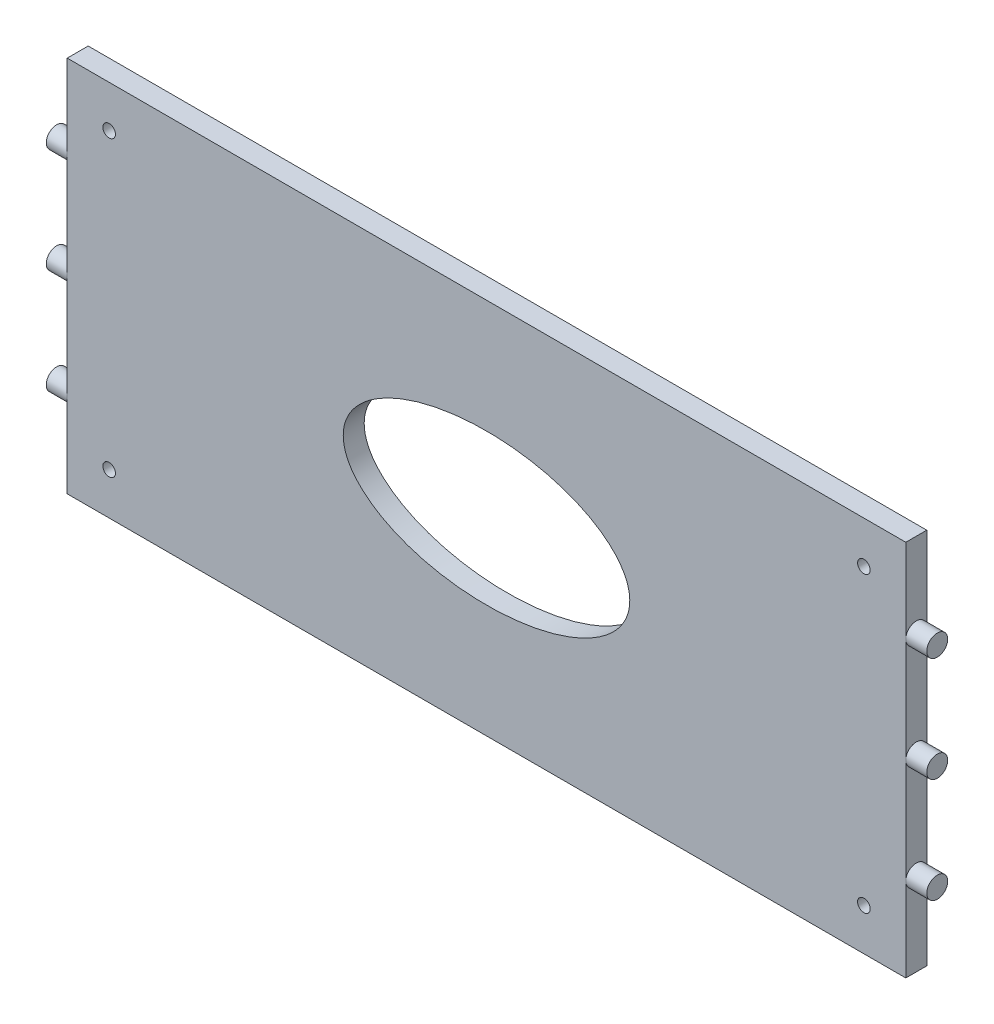
ISO-10303-21;
HEADER;
FILE_DESCRIPTION(('STEP AP214'),'2;1');
FILE_NAME('part.step','',(''),(''),'','','');
FILE_SCHEMA(('AUTOMOTIVE_DESIGN { 1 0 10303 214 1 1 1 1 }'));
ENDSEC;
DATA;
#1=APPLICATION_CONTEXT('core data for automotive mechanical design processes');
#2=APPLICATION_PROTOCOL_DEFINITION('international standard','automotive_design',2000,#1);
#3=PRODUCT_CONTEXT('',#1,'mechanical');
#4=PRODUCT('Part','Part','',(#3));
#5=PRODUCT_RELATED_PRODUCT_CATEGORY('part','',(#4));
#6=PRODUCT_DEFINITION_FORMATION('','',#4);
#7=PRODUCT_DEFINITION_CONTEXT('part definition',#1,'design');
#8=PRODUCT_DEFINITION('design','',#6,#7);
#9=PRODUCT_DEFINITION_SHAPE('','',#8);
#10=(LENGTH_UNIT() NAMED_UNIT(*) SI_UNIT(.MILLI.,.METRE.));
#11=(NAMED_UNIT(*) PLANE_ANGLE_UNIT() SI_UNIT($,.RADIAN.));
#12=(NAMED_UNIT(*) SI_UNIT($,.STERADIAN.) SOLID_ANGLE_UNIT());
#13=UNCERTAINTY_MEASURE_WITH_UNIT(LENGTH_MEASURE(1.E-05),#10,'distance_accuracy_value','');
#14=(GEOMETRIC_REPRESENTATION_CONTEXT(3) GLOBAL_UNCERTAINTY_ASSIGNED_CONTEXT((#13)) GLOBAL_UNIT_ASSIGNED_CONTEXT((#10,
#11,#12)) REPRESENTATION_CONTEXT('',''));
#15=CARTESIAN_POINT('',(0.,0.,0.));
#16=DIRECTION('',(0.,0.,1.));
#17=DIRECTION('',(1.,0.,0.));
#18=AXIS2_PLACEMENT_3D('',#15,#16,#17);
#19=CARTESIAN_POINT('',(-100.,-45.,5.));
#20=DIRECTION('',(1.,0.,0.));
#21=DIRECTION('',(0.,0.,-1.));
#22=AXIS2_PLACEMENT_3D('',#19,#20,#21);
#23=PLANE('',#22);
#24=DIRECTION('',(0.,-1.,0.));
#25=VECTOR('',#24,1.);
#26=CARTESIAN_POINT('',(-100.,-45.,0.));
#27=LINE('',#26,#25);
#28=CARTESIAN_POINT('',(-100.,0.,0.));
#29=VERTEX_POINT('',#28);
#30=CARTESIAN_POINT('',(-100.,-25.,0.));
#31=VERTEX_POINT('',#30);
#32=EDGE_CURVE('E130',#29,#31,#27,.T.);
#33=ORIENTED_EDGE('',*,*,#32,.T.);
#34=CARTESIAN_POINT('',(-100.,-25.,2.5));
#35=DIRECTION('',(1.,0.,0.));
#36=DIRECTION('',(0.,0.,-1.));
#37=AXIS2_PLACEMENT_3D('',#34,#35,#36);
#38=CIRCLE('',#37,2.5);
#39=CARTESIAN_POINT('',(-100.,-25.,5.));
#40=VERTEX_POINT('',#39);
#41=EDGE_CURVE('E56',#31,#40,#38,.T.);
#42=ORIENTED_EDGE('',*,*,#41,.T.);
#43=DIRECTION('',(0.,-1.,0.));
#44=VECTOR('',#43,1.);
#45=CARTESIAN_POINT('',(-100.,-45.,5.));
#46=LINE('',#45,#44);
#47=CARTESIAN_POINT('',(-100.,0.,5.));
#48=VERTEX_POINT('',#47);
#49=EDGE_CURVE('E127',#48,#40,#46,.T.);
#50=ORIENTED_EDGE('',*,*,#49,.F.);
#51=CARTESIAN_POINT('',(-100.,0.,2.5));
#52=DIRECTION('',(1.,0.,0.));
#53=DIRECTION('',(0.,0.,-1.));
#54=AXIS2_PLACEMENT_3D('',#51,#52,#53);
#55=CIRCLE('',#54,2.5);
#56=EDGE_CURVE('E216',#48,#29,#55,.T.);
#57=ORIENTED_EDGE('',*,*,#56,.T.);
#58=EDGE_LOOP('',(#33,#42,#50,#57));
#59=FACE_BOUND('',#58,.T.);
#60=ADVANCED_FACE('F39',(#59),#23,.F.);
#61=CARTESIAN_POINT('',(-100.,25.,0.));
#62=VERTEX_POINT('',#61);
#63=EDGE_CURVE('E164',#62,#29,#27,.T.);
#64=ORIENTED_EDGE('',*,*,#63,.T.);
#65=EDGE_CURVE('E63',#29,#48,#55,.T.);
#66=ORIENTED_EDGE('',*,*,#65,.T.);
#67=CARTESIAN_POINT('',(-100.,25.,5.));
#68=VERTEX_POINT('',#67);
#69=EDGE_CURVE('E145',#68,#48,#46,.T.);
#70=ORIENTED_EDGE('',*,*,#69,.F.);
#71=CARTESIAN_POINT('',(-100.,25.,2.5));
#72=DIRECTION('',(1.,0.,0.));
#73=DIRECTION('',(0.,0.,-1.));
#74=AXIS2_PLACEMENT_3D('',#71,#72,#73);
#75=CIRCLE('',#74,2.5);
#76=EDGE_CURVE('E11',#68,#62,#75,.T.);
#77=ORIENTED_EDGE('',*,*,#76,.T.);
#78=EDGE_LOOP('',(#64,#66,#70,#77));
#79=FACE_BOUND('',#78,.T.);
#80=ADVANCED_FACE('F307',(#79),#23,.F.);
#81=CARTESIAN_POINT('',(-100.,45.,0.));
#82=VERTEX_POINT('',#81);
#83=EDGE_CURVE('E160',#82,#62,#27,.T.);
#84=ORIENTED_EDGE('',*,*,#83,.T.);
#85=EDGE_CURVE('E50',#62,#68,#75,.T.);
#86=ORIENTED_EDGE('',*,*,#85,.T.);
#87=CARTESIAN_POINT('',(-100.,45.,5.));
#88=VERTEX_POINT('',#87);
#89=EDGE_CURVE('E141',#88,#68,#46,.T.);
#90=ORIENTED_EDGE('',*,*,#89,.F.);
#91=DIRECTION('',(0.,0.,-1.));
#92=VECTOR('',#91,1.);
#93=CARTESIAN_POINT('',(-100.,45.,5.));
#94=LINE('',#93,#92);
#95=EDGE_CURVE('E169',#88,#82,#94,.T.);
#96=ORIENTED_EDGE('',*,*,#95,.T.);
#97=EDGE_LOOP('',(#84,#86,#90,#96));
#98=FACE_BOUND('',#97,.T.);
#99=ADVANCED_FACE('F298',(#98),#23,.F.);
#100=CARTESIAN_POINT('',(100.,-45.,5.));
#101=DIRECTION('',(-1.,0.,0.));
#102=DIRECTION('',(0.,0.,1.));
#103=AXIS2_PLACEMENT_3D('',#100,#101,#102);
#104=PLANE('',#103);
#105=CARTESIAN_POINT('',(100.,-25.,2.5));
#106=DIRECTION('',(1.,0.,0.));
#107=DIRECTION('',(0.,0.,-1.));
#108=AXIS2_PLACEMENT_3D('',#105,#106,#107);
#109=CIRCLE('',#108,2.5);
#110=CARTESIAN_POINT('',(100.,-25.,5.));
#111=VERTEX_POINT('',#110);
#112=CARTESIAN_POINT('',(100.,-25.,0.));
#113=VERTEX_POINT('',#112);
#114=EDGE_CURVE('E206',#111,#113,#109,.T.);
#115=ORIENTED_EDGE('',*,*,#114,.F.);
#116=DIRECTION('',(0.,1.,0.));
#117=VECTOR('',#116,1.);
#118=CARTESIAN_POINT('',(100.,-45.,5.));
#119=LINE('',#118,#117);
#120=CARTESIAN_POINT('',(100.,-45.,5.));
#121=VERTEX_POINT('',#120);
#122=EDGE_CURVE('E326',#121,#111,#119,.T.);
#123=ORIENTED_EDGE('',*,*,#122,.F.);
#124=DIRECTION('',(0.,0.,-1.));
#125=VECTOR('',#124,1.);
#126=CARTESIAN_POINT('',(100.,-45.,5.));
#127=LINE('',#126,#125);
#128=CARTESIAN_POINT('',(100.,-45.,0.));
#129=VERTEX_POINT('',#128);
#130=EDGE_CURVE('E151',#121,#129,#127,.T.);
#131=ORIENTED_EDGE('',*,*,#130,.T.);
#132=DIRECTION('',(0.,1.,0.));
#133=VECTOR('',#132,1.);
#134=CARTESIAN_POINT('',(100.,-45.,0.));
#135=LINE('',#134,#133);
#136=EDGE_CURVE('E152',#129,#113,#135,.T.);
#137=ORIENTED_EDGE('',*,*,#136,.T.);
#138=EDGE_LOOP('',(#115,#123,#131,#137));
#139=FACE_BOUND('',#138,.T.);
#140=ADVANCED_FACE('F305',(#139),#104,.F.);
#141=EDGE_CURVE('E202',#113,#111,#109,.T.);
#142=ORIENTED_EDGE('',*,*,#141,.F.);
#143=CARTESIAN_POINT('',(100.,0.,0.));
#144=VERTEX_POINT('',#143);
#145=EDGE_CURVE('E156',#113,#144,#135,.T.);
#146=ORIENTED_EDGE('',*,*,#145,.T.);
#147=CARTESIAN_POINT('',(100.,0.,2.5));
#148=DIRECTION('',(1.,0.,0.));
#149=DIRECTION('',(0.,0.,-1.));
#150=AXIS2_PLACEMENT_3D('',#147,#148,#149);
#151=CIRCLE('',#150,2.5);
#152=CARTESIAN_POINT('',(100.,0.,5.));
#153=VERTEX_POINT('',#152);
#154=EDGE_CURVE('E191',#153,#144,#151,.T.);
#155=ORIENTED_EDGE('',*,*,#154,.F.);
#156=EDGE_CURVE('E328',#111,#153,#119,.T.);
#157=ORIENTED_EDGE('',*,*,#156,.F.);
#158=EDGE_LOOP('',(#142,#146,#155,#157));
#159=FACE_BOUND('',#158,.T.);
#160=ADVANCED_FACE('F339',(#159),#104,.F.);
#161=CARTESIAN_POINT('',(100.,25.,2.5));
#162=DIRECTION('',(1.,0.,0.));
#163=DIRECTION('',(0.,0.,-1.));
#164=AXIS2_PLACEMENT_3D('',#161,#162,#163);
#165=CIRCLE('',#164,2.5);
#166=CARTESIAN_POINT('',(100.,25.,0.));
#167=VERTEX_POINT('',#166);
#168=CARTESIAN_POINT('',(100.,25.,5.));
#169=VERTEX_POINT('',#168);
#170=EDGE_CURVE('E181',#167,#169,#165,.T.);
#171=ORIENTED_EDGE('',*,*,#170,.F.);
#172=CARTESIAN_POINT('',(100.,45.,0.));
#173=VERTEX_POINT('',#172);
#174=EDGE_CURVE('E157',#167,#173,#135,.T.);
#175=ORIENTED_EDGE('',*,*,#174,.T.);
#176=DIRECTION('',(0.,0.,-1.));
#177=VECTOR('',#176,1.);
#178=CARTESIAN_POINT('',(100.,45.,5.));
#179=LINE('',#178,#177);
#180=CARTESIAN_POINT('',(100.,45.,5.));
#181=VERTEX_POINT('',#180);
#182=EDGE_CURVE('E43',#181,#173,#179,.T.);
#183=ORIENTED_EDGE('',*,*,#182,.F.);
#184=EDGE_CURVE('E166',#169,#181,#119,.T.);
#185=ORIENTED_EDGE('',*,*,#184,.F.);
#186=EDGE_LOOP('',(#171,#175,#183,#185));
#187=FACE_BOUND('',#186,.T.);
#188=ADVANCED_FACE('F303',(#187),#104,.F.);
#189=EDGE_CURVE('E187',#144,#153,#151,.T.);
#190=ORIENTED_EDGE('',*,*,#189,.F.);
#191=EDGE_CURVE('E333',#144,#167,#135,.T.);
#192=ORIENTED_EDGE('',*,*,#191,.T.);
#193=EDGE_CURVE('E48',#169,#167,#165,.T.);
#194=ORIENTED_EDGE('',*,*,#193,.F.);
#195=EDGE_CURVE('E329',#153,#169,#119,.T.);
#196=ORIENTED_EDGE('',*,*,#195,.F.);
#197=EDGE_LOOP('',(#190,#192,#194,#196));
#198=FACE_BOUND('',#197,.T.);
#199=ADVANCED_FACE('F41',(#198),#104,.F.);
#200=CARTESIAN_POINT('',(-100.,45.,5.));
#201=DIRECTION('',(0.,-1.,0.));
#202=DIRECTION('',(0.,0.,-1.));
#203=AXIS2_PLACEMENT_3D('',#200,#201,#202);
#204=PLANE('',#203);
#205=DIRECTION('',(-1.,0.,0.));
#206=VECTOR('',#205,1.);
#207=CARTESIAN_POINT('',(-100.,45.,0.));
#208=LINE('',#207,#206);
#209=EDGE_CURVE('E155',#173,#82,#208,.T.);
#210=ORIENTED_EDGE('',*,*,#209,.T.);
#211=ORIENTED_EDGE('',*,*,#95,.F.);
#212=DIRECTION('',(-1.,0.,0.));
#213=VECTOR('',#212,1.);
#214=CARTESIAN_POINT('',(-100.,45.,5.));
#215=LINE('',#214,#213);
#216=EDGE_CURVE('E139',#181,#88,#215,.T.);
#217=ORIENTED_EDGE('',*,*,#216,.F.);
#218=ORIENTED_EDGE('',*,*,#182,.T.);
#219=EDGE_LOOP('',(#210,#211,#217,#218));
#220=FACE_BOUND('',#219,.T.);
#221=ADVANCED_FACE('F297',(#220),#204,.F.);
#222=CARTESIAN_POINT('',(-100.,-45.,5.));
#223=VERTEX_POINT('',#222);
#224=EDGE_CURVE('E133',#40,#223,#46,.T.);
#225=ORIENTED_EDGE('',*,*,#224,.F.);
#226=EDGE_CURVE('E116',#40,#31,#38,.T.);
#227=ORIENTED_EDGE('',*,*,#226,.T.);
#228=CARTESIAN_POINT('',(-100.,-45.,0.));
#229=VERTEX_POINT('',#228);
#230=EDGE_CURVE('E159',#31,#229,#27,.T.);
#231=ORIENTED_EDGE('',*,*,#230,.T.);
#232=DIRECTION('',(0.,0.,-1.));
#233=VECTOR('',#232,1.);
#234=CARTESIAN_POINT('',(-100.,-45.,5.));
#235=LINE('',#234,#233);
#236=EDGE_CURVE('E136',#223,#229,#235,.T.);
#237=ORIENTED_EDGE('',*,*,#236,.F.);
#238=EDGE_LOOP('',(#225,#227,#231,#237));
#239=FACE_BOUND('',#238,.T.);
#240=ADVANCED_FACE('F134',(#239),#23,.F.);
#241=CARTESIAN_POINT('',(-100.,-45.,5.));
#242=DIRECTION('',(0.,1.,0.));
#243=DIRECTION('',(0.,0.,1.));
#244=AXIS2_PLACEMENT_3D('',#241,#242,#243);
#245=PLANE('',#244);
#246=DIRECTION('',(1.,0.,0.));
#247=VECTOR('',#246,1.);
#248=CARTESIAN_POINT('',(-100.,-45.,0.));
#249=LINE('',#248,#247);
#250=EDGE_CURVE('E163',#229,#129,#249,.T.);
#251=ORIENTED_EDGE('',*,*,#250,.T.);
#252=ORIENTED_EDGE('',*,*,#130,.F.);
#253=DIRECTION('',(1.,0.,0.));
#254=VECTOR('',#253,1.);
#255=CARTESIAN_POINT('',(-100.,-45.,5.));
#256=LINE('',#255,#254);
#257=EDGE_CURVE('E148',#223,#121,#256,.T.);
#258=ORIENTED_EDGE('',*,*,#257,.F.);
#259=ORIENTED_EDGE('',*,*,#236,.T.);
#260=EDGE_LOOP('',(#251,#252,#258,#259));
#261=FACE_BOUND('',#260,.T.);
#262=ADVANCED_FACE('F288',(#261),#245,.F.);
#263=CARTESIAN_POINT('',(0.,0.,5.));
#264=DIRECTION('',(0.,0.,-1.));
#265=DIRECTION('',(-1.,0.,0.));
#266=AXIS2_PLACEMENT_3D('',#263,#264,#265);
#267=PLANE('',#266);
#268=CARTESIAN_POINT('',(-90.,35.,5.));
#269=DIRECTION('',(0.,0.,-1.));
#270=DIRECTION('',(1.,0.,0.));
#271=AXIS2_PLACEMENT_3D('',#268,#269,#270);
#272=CIRCLE('',#271,1.5);
#273=CARTESIAN_POINT('',(-88.5,35.,5.));
#274=VERTEX_POINT('',#273);
#275=EDGE_CURVE('E228',#274,#274,#272,.T.);
#276=ORIENTED_EDGE('',*,*,#275,.T.);
#277=EDGE_LOOP('',(#276));
#278=FACE_BOUND('',#277,.T.);
#279=CARTESIAN_POINT('',(-90.,-35.,5.));
#280=DIRECTION('',(0.,0.,-1.));
#281=DIRECTION('',(-1.,0.,0.));
#282=AXIS2_PLACEMENT_3D('',#279,#280,#281);
#283=CIRCLE('',#282,1.5);
#284=CARTESIAN_POINT('',(-91.5,-35.,5.));
#285=VERTEX_POINT('',#284);
#286=EDGE_CURVE('E593',#285,#285,#283,.T.);
#287=ORIENTED_EDGE('',*,*,#286,.T.);
#288=EDGE_LOOP('',(#287));
#289=FACE_BOUND('',#288,.T.);
#290=CARTESIAN_POINT('',(90.,-35.,5.));
#291=DIRECTION('',(0.,0.,-1.));
#292=DIRECTION('',(1.,0.,0.));
#293=AXIS2_PLACEMENT_3D('',#290,#291,#292);
#294=CIRCLE('',#293,1.5);
#295=CARTESIAN_POINT('',(91.5,-35.,5.));
#296=VERTEX_POINT('',#295);
#297=EDGE_CURVE('E600',#296,#296,#294,.T.);
#298=ORIENTED_EDGE('',*,*,#297,.T.);
#299=EDGE_LOOP('',(#298));
#300=FACE_BOUND('',#299,.T.);
#301=CARTESIAN_POINT('',(90.,35.,5.));
#302=DIRECTION('',(0.,0.,-1.));
#303=DIRECTION('',(-1.,0.,0.));
#304=AXIS2_PLACEMENT_3D('',#301,#302,#303);
#305=CIRCLE('',#304,1.5);
#306=CARTESIAN_POINT('',(88.5,35.,5.));
#307=VERTEX_POINT('',#306);
#308=EDGE_CURVE('E606',#307,#307,#305,.T.);
#309=ORIENTED_EDGE('',*,*,#308,.T.);
#310=EDGE_LOOP('',(#309));
#311=FACE_BOUND('',#310,.T.);
#312=CARTESIAN_POINT('',(0.,0.,5.));
#313=DIRECTION('',(0.,0.,-1.));
#314=DIRECTION('',(-1.,0.,0.));
#315=AXIS2_PLACEMENT_3D('',#312,#313,#314);
#316=ELLIPSE('',#315,34.1713517909551,17.9908772674234);
#317=CARTESIAN_POINT('',(-34.1713517909551,0.,5.));
#318=VERTEX_POINT('',#317);
#319=EDGE_CURVE('E121',#318,#318,#316,.T.);
#320=ORIENTED_EDGE('',*,*,#319,.T.);
#321=EDGE_LOOP('',(#320));
#322=FACE_BOUND('',#321,.T.);
#323=ORIENTED_EDGE('',*,*,#122,.T.);
#324=ORIENTED_EDGE('',*,*,#156,.T.);
#325=ORIENTED_EDGE('',*,*,#195,.T.);
#326=ORIENTED_EDGE('',*,*,#184,.T.);
#327=ORIENTED_EDGE('',*,*,#216,.T.);
#328=ORIENTED_EDGE('',*,*,#89,.T.);
#329=ORIENTED_EDGE('',*,*,#69,.T.);
#330=ORIENTED_EDGE('',*,*,#49,.T.);
#331=ORIENTED_EDGE('',*,*,#224,.T.);
#332=ORIENTED_EDGE('',*,*,#257,.T.);
#333=EDGE_LOOP('',(#323,#324,#325,#326,#327,#328,#329,#330,#331,#332));
#334=FACE_BOUND('',#333,.T.);
#335=ADVANCED_FACE('F142',(#278,#289,#300,#311,#322,#334),#267,.F.);
#336=CARTESIAN_POINT('',(0.,0.,0.));
#337=DIRECTION('',(0.,0.,-1.));
#338=DIRECTION('',(-1.,0.,0.));
#339=AXIS2_PLACEMENT_3D('',#336,#337,#338);
#340=PLANE('',#339);
#341=CARTESIAN_POINT('',(-90.,35.,0.));
#342=DIRECTION('',(0.,0.,-1.));
#343=DIRECTION('',(1.,0.,0.));
#344=AXIS2_PLACEMENT_3D('',#341,#342,#343);
#345=CIRCLE('',#344,1.5);
#346=CARTESIAN_POINT('',(-88.5,35.,0.));
#347=VERTEX_POINT('',#346);
#348=EDGE_CURVE('E592',#347,#347,#345,.T.);
#349=ORIENTED_EDGE('',*,*,#348,.F.);
#350=EDGE_LOOP('',(#349));
#351=FACE_BOUND('',#350,.T.);
#352=CARTESIAN_POINT('',(-90.,-35.,0.));
#353=DIRECTION('',(0.,0.,-1.));
#354=DIRECTION('',(-1.,0.,0.));
#355=AXIS2_PLACEMENT_3D('',#352,#353,#354);
#356=CIRCLE('',#355,1.5);
#357=CARTESIAN_POINT('',(-91.5,-35.,0.));
#358=VERTEX_POINT('',#357);
#359=EDGE_CURVE('E595',#358,#358,#356,.T.);
#360=ORIENTED_EDGE('',*,*,#359,.F.);
#361=EDGE_LOOP('',(#360));
#362=FACE_BOUND('',#361,.T.);
#363=CARTESIAN_POINT('',(90.,-35.,0.));
#364=DIRECTION('',(0.,0.,-1.));
#365=DIRECTION('',(1.,0.,0.));
#366=AXIS2_PLACEMENT_3D('',#363,#364,#365);
#367=CIRCLE('',#366,1.5);
#368=CARTESIAN_POINT('',(91.5,-35.,0.));
#369=VERTEX_POINT('',#368);
#370=EDGE_CURVE('E603',#369,#369,#367,.T.);
#371=ORIENTED_EDGE('',*,*,#370,.F.);
#372=EDGE_LOOP('',(#371));
#373=FACE_BOUND('',#372,.T.);
#374=CARTESIAN_POINT('',(90.,35.,0.));
#375=DIRECTION('',(0.,0.,-1.));
#376=DIRECTION('',(-1.,0.,0.));
#377=AXIS2_PLACEMENT_3D('',#374,#375,#376);
#378=CIRCLE('',#377,1.5);
#379=CARTESIAN_POINT('',(88.5,35.,0.));
#380=VERTEX_POINT('',#379);
#381=EDGE_CURVE('E224',#380,#380,#378,.T.);
#382=ORIENTED_EDGE('',*,*,#381,.F.);
#383=EDGE_LOOP('',(#382));
#384=FACE_BOUND('',#383,.T.);
#385=CARTESIAN_POINT('',(0.,0.,0.));
#386=DIRECTION('',(0.,0.,-1.));
#387=DIRECTION('',(-1.,0.,0.));
#388=AXIS2_PLACEMENT_3D('',#385,#386,#387);
#389=ELLIPSE('',#388,34.1713517909551,17.9908772674234);
#390=CARTESIAN_POINT('',(-34.1713517909551,0.,0.));
#391=VERTEX_POINT('',#390);
#392=EDGE_CURVE('E221',#391,#391,#389,.T.);
#393=ORIENTED_EDGE('',*,*,#392,.F.);
#394=EDGE_LOOP('',(#393));
#395=FACE_BOUND('',#394,.T.);
#396=ORIENTED_EDGE('',*,*,#136,.F.);
#397=ORIENTED_EDGE('',*,*,#250,.F.);
#398=ORIENTED_EDGE('',*,*,#230,.F.);
#399=ORIENTED_EDGE('',*,*,#32,.F.);
#400=ORIENTED_EDGE('',*,*,#63,.F.);
#401=ORIENTED_EDGE('',*,*,#83,.F.);
#402=ORIENTED_EDGE('',*,*,#209,.F.);
#403=ORIENTED_EDGE('',*,*,#174,.F.);
#404=ORIENTED_EDGE('',*,*,#191,.F.);
#405=ORIENTED_EDGE('',*,*,#145,.F.);
#406=EDGE_LOOP('',(#396,#397,#398,#399,#400,#401,#402,#403,#404,#405));
#407=FACE_BOUND('',#406,.T.);
#408=ADVANCED_FACE('F284',(#351,#362,#373,#384,#395,#407),#340,.T.);
#409=CARTESIAN_POINT('',(105.,25.,2.5));
#410=DIRECTION('',(-1.,0.,0.));
#411=DIRECTION('',(0.,0.,1.));
#412=AXIS2_PLACEMENT_3D('',#409,#410,#411);
#413=CYLINDRICAL_SURFACE('',#412,2.5);
#414=CARTESIAN_POINT('',(105.,25.,2.5));
#415=DIRECTION('',(1.,0.,0.));
#416=DIRECTION('',(0.,0.,-1.));
#417=AXIS2_PLACEMENT_3D('',#414,#415,#416);
#418=CIRCLE('',#417,2.5);
#419=CARTESIAN_POINT('',(105.,25.,0.));
#420=VERTEX_POINT('',#419);
#421=EDGE_CURVE('E186',#420,#420,#418,.T.);
#422=ORIENTED_EDGE('',*,*,#421,.F.);
#423=EDGE_LOOP('',(#422));
#424=FACE_BOUND('',#423,.T.);
#425=ORIENTED_EDGE('',*,*,#170,.T.);
#426=ORIENTED_EDGE('',*,*,#193,.T.);
#427=EDGE_LOOP('',(#425,#426));
#428=FACE_BOUND('',#427,.T.);
#429=ADVANCED_FACE('F280',(#424,#428),#413,.T.);
#430=CARTESIAN_POINT('',(105.,0.,0.));
#431=DIRECTION('',(1.,0.,0.));
#432=DIRECTION('',(0.,0.,-1.));
#433=AXIS2_PLACEMENT_3D('',#430,#431,#432);
#434=PLANE('',#433);
#435=ORIENTED_EDGE('',*,*,#421,.T.);
#436=EDGE_LOOP('',(#435));
#437=FACE_BOUND('',#436,.T.);
#438=ADVANCED_FACE('F274',(#437),#434,.T.);
#439=CARTESIAN_POINT('',(105.,0.,2.5));
#440=DIRECTION('',(-1.,0.,0.));
#441=DIRECTION('',(0.,0.,1.));
#442=AXIS2_PLACEMENT_3D('',#439,#440,#441);
#443=CYLINDRICAL_SURFACE('',#442,2.5);
#444=CARTESIAN_POINT('',(105.,0.,2.5));
#445=DIRECTION('',(1.,0.,0.));
#446=DIRECTION('',(0.,0.,-1.));
#447=AXIS2_PLACEMENT_3D('',#444,#445,#446);
#448=CIRCLE('',#447,2.5);
#449=CARTESIAN_POINT('',(105.,0.,0.));
#450=VERTEX_POINT('',#449);
#451=EDGE_CURVE('E196',#450,#450,#448,.T.);
#452=ORIENTED_EDGE('',*,*,#451,.F.);
#453=EDGE_LOOP('',(#452));
#454=FACE_BOUND('',#453,.T.);
#455=ORIENTED_EDGE('',*,*,#189,.T.);
#456=ORIENTED_EDGE('',*,*,#154,.T.);
#457=EDGE_LOOP('',(#455,#456));
#458=FACE_BOUND('',#457,.T.);
#459=ADVANCED_FACE('F271',(#454,#458),#443,.T.);
#460=CARTESIAN_POINT('',(105.,0.,0.));
#461=DIRECTION('',(1.,0.,0.));
#462=DIRECTION('',(0.,0.,-1.));
#463=AXIS2_PLACEMENT_3D('',#460,#461,#462);
#464=PLANE('',#463);
#465=ORIENTED_EDGE('',*,*,#451,.T.);
#466=EDGE_LOOP('',(#465));
#467=FACE_BOUND('',#466,.T.);
#468=ADVANCED_FACE('F266',(#467),#464,.T.);
#469=CARTESIAN_POINT('',(105.,-25.,2.5));
#470=DIRECTION('',(-1.,0.,0.));
#471=DIRECTION('',(0.,0.,1.));
#472=AXIS2_PLACEMENT_3D('',#469,#470,#471);
#473=CYLINDRICAL_SURFACE('',#472,2.5);
#474=CARTESIAN_POINT('',(105.,-25.,2.5));
#475=DIRECTION('',(1.,0.,0.));
#476=DIRECTION('',(0.,0.,-1.));
#477=AXIS2_PLACEMENT_3D('',#474,#475,#476);
#478=CIRCLE('',#477,2.5);
#479=CARTESIAN_POINT('',(105.,-25.,0.));
#480=VERTEX_POINT('',#479);
#481=EDGE_CURVE('E199',#480,#480,#478,.T.);
#482=ORIENTED_EDGE('',*,*,#481,.F.);
#483=EDGE_LOOP('',(#482));
#484=FACE_BOUND('',#483,.T.);
#485=ORIENTED_EDGE('',*,*,#141,.T.);
#486=ORIENTED_EDGE('',*,*,#114,.T.);
#487=EDGE_LOOP('',(#485,#486));
#488=FACE_BOUND('',#487,.T.);
#489=ADVANCED_FACE('F263',(#484,#488),#473,.T.);
#490=CARTESIAN_POINT('',(105.,-25.,2.5));
#491=DIRECTION('',(1.,0.,0.));
#492=DIRECTION('',(0.,0.,-1.));
#493=AXIS2_PLACEMENT_3D('',#490,#491,#492);
#494=PLANE('',#493);
#495=ORIENTED_EDGE('',*,*,#481,.T.);
#496=EDGE_LOOP('',(#495));
#497=FACE_BOUND('',#496,.T.);
#498=ADVANCED_FACE('F261',(#497),#494,.T.);
#499=CARTESIAN_POINT('',(-105.,25.,2.5));
#500=DIRECTION('',(1.,0.,0.));
#501=DIRECTION('',(0.,0.,-1.));
#502=AXIS2_PLACEMENT_3D('',#499,#500,#501);
#503=CYLINDRICAL_SURFACE('',#502,2.5);
#504=CARTESIAN_POINT('',(-105.,25.,2.5));
#505=DIRECTION('',(1.,0.,0.));
#506=DIRECTION('',(0.,0.,-1.));
#507=AXIS2_PLACEMENT_3D('',#504,#505,#506);
#508=CIRCLE('',#507,2.5);
#509=CARTESIAN_POINT('',(-105.,25.,0.));
#510=VERTEX_POINT('',#509);
#511=EDGE_CURVE('E211',#510,#510,#508,.T.);
#512=ORIENTED_EDGE('',*,*,#511,.T.);
#513=EDGE_LOOP('',(#512));
#514=FACE_BOUND('',#513,.T.);
#515=ORIENTED_EDGE('',*,*,#85,.F.);
#516=ORIENTED_EDGE('',*,*,#76,.F.);
#517=EDGE_LOOP('',(#515,#516));
#518=FACE_BOUND('',#517,.T.);
#519=ADVANCED_FACE('F257',(#514,#518),#503,.T.);
#520=CARTESIAN_POINT('',(-105.,0.,0.));
#521=DIRECTION('',(-1.,0.,0.));
#522=DIRECTION('',(0.,0.,-1.));
#523=AXIS2_PLACEMENT_3D('',#520,#521,#522);
#524=PLANE('',#523);
#525=ORIENTED_EDGE('',*,*,#511,.F.);
#526=EDGE_LOOP('',(#525));
#527=FACE_BOUND('',#526,.T.);
#528=ADVANCED_FACE('F253',(#527),#524,.T.);
#529=CARTESIAN_POINT('',(-105.,0.,2.5));
#530=DIRECTION('',(1.,0.,0.));
#531=DIRECTION('',(0.,0.,-1.));
#532=AXIS2_PLACEMENT_3D('',#529,#530,#531);
#533=CYLINDRICAL_SURFACE('',#532,2.5);
#534=CARTESIAN_POINT('',(-105.,0.,2.5));
#535=DIRECTION('',(1.,0.,0.));
#536=DIRECTION('',(0.,0.,-1.));
#537=AXIS2_PLACEMENT_3D('',#534,#535,#536);
#538=CIRCLE('',#537,2.5);
#539=CARTESIAN_POINT('',(-105.,0.,0.));
#540=VERTEX_POINT('',#539);
#541=EDGE_CURVE('E212',#540,#540,#538,.T.);
#542=ORIENTED_EDGE('',*,*,#541,.T.);
#543=EDGE_LOOP('',(#542));
#544=FACE_BOUND('',#543,.T.);
#545=ORIENTED_EDGE('',*,*,#65,.F.);
#546=ORIENTED_EDGE('',*,*,#56,.F.);
#547=EDGE_LOOP('',(#545,#546));
#548=FACE_BOUND('',#547,.T.);
#549=ADVANCED_FACE('F249',(#544,#548),#533,.T.);
#550=CARTESIAN_POINT('',(-105.,0.,0.));
#551=DIRECTION('',(-1.,0.,0.));
#552=DIRECTION('',(0.,0.,-1.));
#553=AXIS2_PLACEMENT_3D('',#550,#551,#552);
#554=PLANE('',#553);
#555=ORIENTED_EDGE('',*,*,#541,.F.);
#556=EDGE_LOOP('',(#555));
#557=FACE_BOUND('',#556,.T.);
#558=ADVANCED_FACE('F245',(#557),#554,.T.);
#559=CARTESIAN_POINT('',(-105.,-25.,2.5));
#560=DIRECTION('',(1.,0.,0.));
#561=DIRECTION('',(0.,0.,-1.));
#562=AXIS2_PLACEMENT_3D('',#559,#560,#561);
#563=CYLINDRICAL_SURFACE('',#562,2.5);
#564=CARTESIAN_POINT('',(-105.,-25.,2.5));
#565=DIRECTION('',(1.,0.,0.));
#566=DIRECTION('',(0.,0.,-1.));
#567=AXIS2_PLACEMENT_3D('',#564,#565,#566);
#568=CIRCLE('',#567,2.5);
#569=CARTESIAN_POINT('',(-105.,-25.,0.));
#570=VERTEX_POINT('',#569);
#571=EDGE_CURVE('E131',#570,#570,#568,.T.);
#572=ORIENTED_EDGE('',*,*,#571,.T.);
#573=EDGE_LOOP('',(#572));
#574=FACE_BOUND('',#573,.T.);
#575=ORIENTED_EDGE('',*,*,#41,.F.);
#576=ORIENTED_EDGE('',*,*,#226,.F.);
#577=EDGE_LOOP('',(#575,#576));
#578=FACE_BOUND('',#577,.T.);
#579=ADVANCED_FACE('F117',(#574,#578),#563,.T.);
#580=CARTESIAN_POINT('',(-105.,-25.,2.5));
#581=DIRECTION('',(-1.,0.,0.));
#582=DIRECTION('',(0.,0.,-1.));
#583=AXIS2_PLACEMENT_3D('',#580,#581,#582);
#584=PLANE('',#583);
#585=ORIENTED_EDGE('',*,*,#571,.F.);
#586=EDGE_LOOP('',(#585));
#587=FACE_BOUND('',#586,.T.);
#588=ADVANCED_FACE('F236',(#587),#584,.T.);
#589=DIRECTION('',(0.,0.,-1.));
#590=VECTOR('',#589,1.);
#591=SURFACE_OF_LINEAR_EXTRUSION('',#316,#590);
#592=ORIENTED_EDGE('',*,*,#319,.F.);
#593=EDGE_LOOP('',(#592));
#594=FACE_BOUND('',#593,.T.);
#595=ORIENTED_EDGE('',*,*,#392,.T.);
#596=EDGE_LOOP('',(#595));
#597=FACE_BOUND('',#596,.T.);
#598=ADVANCED_FACE('F231',(#594,#597),#591,.F.);
#599=CARTESIAN_POINT('',(90.,35.,5.));
#600=DIRECTION('',(0.,0.,-1.));
#601=DIRECTION('',(-1.,0.,0.));
#602=AXIS2_PLACEMENT_3D('',#599,#600,#601);
#603=CYLINDRICAL_SURFACE('',#602,1.5);
#604=ORIENTED_EDGE('',*,*,#308,.F.);
#605=EDGE_LOOP('',(#604));
#606=FACE_BOUND('',#605,.T.);
#607=ORIENTED_EDGE('',*,*,#381,.T.);
#608=EDGE_LOOP('',(#607));
#609=FACE_BOUND('',#608,.T.);
#610=ADVANCED_FACE('F235',(#606,#609),#603,.F.);
#611=CARTESIAN_POINT('',(90.,-35.,5.));
#612=DIRECTION('',(0.,0.,-1.));
#613=DIRECTION('',(-1.,0.,0.));
#614=AXIS2_PLACEMENT_3D('',#611,#612,#613);
#615=CYLINDRICAL_SURFACE('',#614,1.5);
#616=ORIENTED_EDGE('',*,*,#297,.F.);
#617=EDGE_LOOP('',(#616));
#618=FACE_BOUND('',#617,.T.);
#619=ORIENTED_EDGE('',*,*,#370,.T.);
#620=EDGE_LOOP('',(#619));
#621=FACE_BOUND('',#620,.T.);
#622=ADVANCED_FACE('F438',(#618,#621),#615,.F.);
#623=CARTESIAN_POINT('',(-90.,-35.,5.));
#624=DIRECTION('',(0.,0.,-1.));
#625=DIRECTION('',(-1.,0.,0.));
#626=AXIS2_PLACEMENT_3D('',#623,#624,#625);
#627=CYLINDRICAL_SURFACE('',#626,1.5);
#628=ORIENTED_EDGE('',*,*,#286,.F.);
#629=EDGE_LOOP('',(#628));
#630=FACE_BOUND('',#629,.T.);
#631=ORIENTED_EDGE('',*,*,#359,.T.);
#632=EDGE_LOOP('',(#631));
#633=FACE_BOUND('',#632,.T.);
#634=ADVANCED_FACE('F449',(#630,#633),#627,.F.);
#635=CARTESIAN_POINT('',(-90.,35.,5.));
#636=DIRECTION('',(0.,0.,-1.));
#637=DIRECTION('',(-1.,0.,0.));
#638=AXIS2_PLACEMENT_3D('',#635,#636,#637);
#639=CYLINDRICAL_SURFACE('',#638,1.5);
#640=ORIENTED_EDGE('',*,*,#275,.F.);
#641=EDGE_LOOP('',(#640));
#642=FACE_BOUND('',#641,.T.);
#643=ORIENTED_EDGE('',*,*,#348,.T.);
#644=EDGE_LOOP('',(#643));
#645=FACE_BOUND('',#644,.T.);
#646=ADVANCED_FACE('F238',(#642,#645),#639,.F.);
#647=CLOSED_SHELL('',(#60,#80,#99,#140,#160,#188,#199,#221,#240,#262,#335,#408,#429,#438,#459,
#468,#489,#498,#519,#528,#549,#558,#579,#588,#598,#610,#622,#634,#646));
#648=MANIFOLD_SOLID_BREP('B2',#647);
#649=ADVANCED_BREP_SHAPE_REPRESENTATION('',(#18,#648),#14);
#650=SHAPE_DEFINITION_REPRESENTATION(#9,#649);
ENDSEC;
END-ISO-10303-21;
